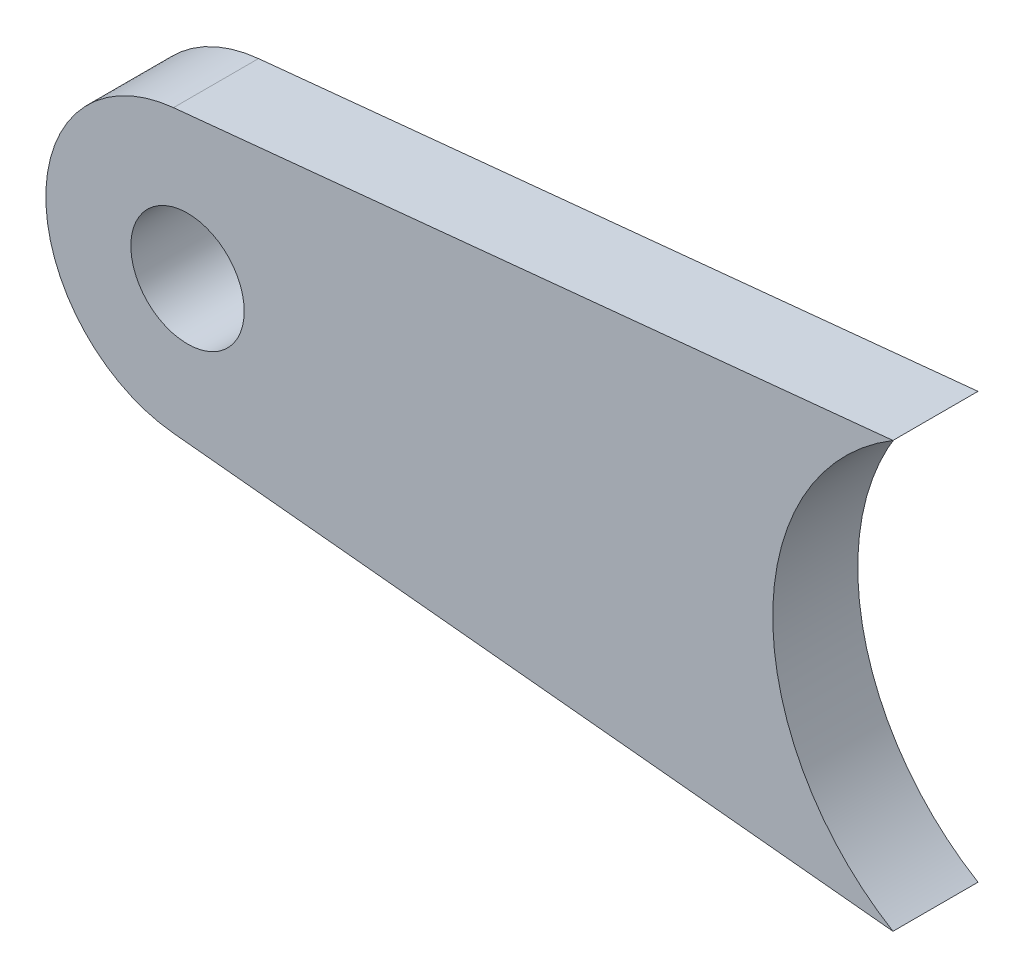
ISO-10303-21;
HEADER;
FILE_DESCRIPTION(('STEP AP214'),'2;1');
FILE_NAME('part.step','',(''),(''),'','','');
FILE_SCHEMA(('AUTOMOTIVE_DESIGN { 1 0 10303 214 1 1 1 1 }'));
ENDSEC;
DATA;
#1=APPLICATION_CONTEXT('core data for automotive mechanical design processes');
#2=APPLICATION_PROTOCOL_DEFINITION('international standard','automotive_design',2000,#1);
#3=PRODUCT_CONTEXT('',#1,'mechanical');
#4=PRODUCT('Part','Part','',(#3));
#5=PRODUCT_RELATED_PRODUCT_CATEGORY('part','',(#4));
#6=PRODUCT_DEFINITION_FORMATION('','',#4);
#7=PRODUCT_DEFINITION_CONTEXT('part definition',#1,'design');
#8=PRODUCT_DEFINITION('design','',#6,#7);
#9=PRODUCT_DEFINITION_SHAPE('','',#8);
#10=(LENGTH_UNIT() NAMED_UNIT(*) SI_UNIT(.MILLI.,.METRE.));
#11=(NAMED_UNIT(*) PLANE_ANGLE_UNIT() SI_UNIT($,.RADIAN.));
#12=(NAMED_UNIT(*) SI_UNIT($,.STERADIAN.) SOLID_ANGLE_UNIT());
#13=UNCERTAINTY_MEASURE_WITH_UNIT(LENGTH_MEASURE(1.E-05),#10,'distance_accuracy_value','');
#14=(GEOMETRIC_REPRESENTATION_CONTEXT(3) GLOBAL_UNCERTAINTY_ASSIGNED_CONTEXT((#13)) GLOBAL_UNIT_ASSIGNED_CONTEXT((#10,
#11,#12)) REPRESENTATION_CONTEXT('',''));
#15=CARTESIAN_POINT('',(0.,0.,0.));
#16=DIRECTION('',(0.,0.,1.));
#17=DIRECTION('',(1.,0.,0.));
#18=AXIS2_PLACEMENT_3D('',#15,#16,#17);
#19=CARTESIAN_POINT('',(111.141859777511,77.1269186430559,6.));
#20=DIRECTION('',(0.,0.,1.));
#21=DIRECTION('',(1.,0.,0.));
#22=AXIS2_PLACEMENT_3D('',#19,#20,#21);
#23=PLANE('',#22);
#24=CARTESIAN_POINT('',(111.141859777511,77.1269186430559,6.));
#25=DIRECTION('',(0.,0.,-1.));
#26=DIRECTION('',(1.,0.,0.));
#27=AXIS2_PLACEMENT_3D('',#24,#25,#26);
#28=CIRCLE('',#27,35.);
#29=CARTESIAN_POINT('',(93.114103400191,47.1269186430559,6.));
#30=VERTEX_POINT('',#29);
#31=CARTESIAN_POINT('',(93.114103400191,107.126918643056,6.));
#32=VERTEX_POINT('',#31);
#33=EDGE_CURVE('E87',#30,#32,#28,.T.);
#34=ORIENTED_EDGE('',*,*,#33,.T.);
#35=DIRECTION('',(-0.995092310823552,-0.0989509622987178,0.));
#36=VECTOR('',#35,1.);
#37=CARTESIAN_POINT('',(93.114103400191,107.126918643056,6.));
#38=LINE('',#37,#36);
#39=CARTESIAN_POINT('',(-8.43715946846341,97.028764859527,6.));
#40=VERTEX_POINT('',#39);
#41=EDGE_CURVE('E82',#32,#40,#38,.T.);
#42=ORIENTED_EDGE('',*,*,#41,.T.);
#43=CARTESIAN_POINT('',(-6.45814022248904,77.1269186430559,6.));
#44=DIRECTION('',(0.,0.,1.));
#45=DIRECTION('',(1.,0.,0.));
#46=AXIS2_PLACEMENT_3D('',#43,#44,#45);
#47=CIRCLE('',#46,20.);
#48=CARTESIAN_POINT('',(-8.43715946846342,57.2250724265849,6.));
#49=VERTEX_POINT('',#48);
#50=EDGE_CURVE('E85',#40,#49,#47,.T.);
#51=ORIENTED_EDGE('',*,*,#50,.T.);
#52=DIRECTION('',(0.995092310823552,-0.0989509622987179,0.));
#53=VECTOR('',#52,1.);
#54=CARTESIAN_POINT('',(-8.43715946846341,57.2250724265849,6.));
#55=LINE('',#54,#53);
#56=EDGE_CURVE('E52',#49,#30,#55,.T.);
#57=ORIENTED_EDGE('',*,*,#56,.T.);
#58=EDGE_LOOP('',(#34,#42,#51,#57));
#59=FACE_BOUND('',#58,.T.);
#60=CARTESIAN_POINT('',(-6.45814022248904,77.1269186430559,6.));
#61=DIRECTION('',(0.,0.,1.));
#62=DIRECTION('',(1.,0.,0.));
#63=AXIS2_PLACEMENT_3D('',#60,#61,#62);
#64=CIRCLE('',#63,8.);
#65=CARTESIAN_POINT('',(1.54185977751096,77.1269186430559,6.));
#66=VERTEX_POINT('',#65);
#67=EDGE_CURVE('E102',#66,#66,#64,.T.);
#68=ORIENTED_EDGE('',*,*,#67,.F.);
#69=EDGE_LOOP('',(#68));
#70=FACE_BOUND('',#69,.T.);
#71=ADVANCED_FACE('F35',(#59,#70),#23,.T.);
#72=CARTESIAN_POINT('',(111.141859777511,77.1269186430559,-6.));
#73=DIRECTION('',(0.,0.,1.));
#74=DIRECTION('',(1.,0.,0.));
#75=AXIS2_PLACEMENT_3D('',#72,#73,#74);
#76=PLANE('',#75);
#77=CARTESIAN_POINT('',(111.141859777511,77.1269186430559,-6.));
#78=DIRECTION('',(0.,0.,-1.));
#79=DIRECTION('',(1.,0.,0.));
#80=AXIS2_PLACEMENT_3D('',#77,#78,#79);
#81=CIRCLE('',#80,35.);
#82=CARTESIAN_POINT('',(93.114103400191,47.1269186430559,-6.));
#83=VERTEX_POINT('',#82);
#84=CARTESIAN_POINT('',(93.114103400191,107.126918643056,-6.));
#85=VERTEX_POINT('',#84);
#86=EDGE_CURVE('E99',#83,#85,#81,.T.);
#87=ORIENTED_EDGE('',*,*,#86,.F.);
#88=DIRECTION('',(0.995092310823552,-0.0989509622987179,0.));
#89=VECTOR('',#88,1.);
#90=CARTESIAN_POINT('',(-8.43715946846341,57.2250724265849,-6.));
#91=LINE('',#90,#89);
#92=CARTESIAN_POINT('',(-8.43715946846342,57.2250724265849,-6.));
#93=VERTEX_POINT('',#92);
#94=EDGE_CURVE('E75',#93,#83,#91,.T.);
#95=ORIENTED_EDGE('',*,*,#94,.F.);
#96=CARTESIAN_POINT('',(-6.45814022248904,77.1269186430559,-6.));
#97=DIRECTION('',(0.,0.,1.));
#98=DIRECTION('',(1.,0.,0.));
#99=AXIS2_PLACEMENT_3D('',#96,#97,#98);
#100=CIRCLE('',#99,20.);
#101=CARTESIAN_POINT('',(-8.43715946846341,97.028764859527,-6.));
#102=VERTEX_POINT('',#101);
#103=EDGE_CURVE('E69',#102,#93,#100,.T.);
#104=ORIENTED_EDGE('',*,*,#103,.F.);
#105=DIRECTION('',(-0.995092310823552,-0.0989509622987178,0.));
#106=VECTOR('',#105,1.);
#107=CARTESIAN_POINT('',(93.114103400191,107.126918643056,-6.));
#108=LINE('',#107,#106);
#109=EDGE_CURVE('E91',#85,#102,#108,.T.);
#110=ORIENTED_EDGE('',*,*,#109,.F.);
#111=EDGE_LOOP('',(#87,#95,#104,#110));
#112=FACE_BOUND('',#111,.T.);
#113=CARTESIAN_POINT('',(-6.45814022248904,77.1269186430559,-6.));
#114=DIRECTION('',(0.,0.,1.));
#115=DIRECTION('',(1.,0.,0.));
#116=AXIS2_PLACEMENT_3D('',#113,#114,#115);
#117=CIRCLE('',#116,8.);
#118=CARTESIAN_POINT('',(1.54185977751096,77.1269186430559,-6.));
#119=VERTEX_POINT('',#118);
#120=EDGE_CURVE('E114',#119,#119,#117,.T.);
#121=ORIENTED_EDGE('',*,*,#120,.T.);
#122=EDGE_LOOP('',(#121));
#123=FACE_BOUND('',#122,.T.);
#124=ADVANCED_FACE('F110',(#112,#123),#76,.F.);
#125=CARTESIAN_POINT('',(111.141859777511,77.1269186430559,6.));
#126=DIRECTION('',(0.,0.,-1.));
#127=DIRECTION('',(-1.,0.,0.));
#128=AXIS2_PLACEMENT_3D('',#125,#126,#127);
#129=CYLINDRICAL_SURFACE('',#128,35.);
#130=ORIENTED_EDGE('',*,*,#86,.T.);
#131=DIRECTION('',(0.,0.,-1.));
#132=VECTOR('',#131,1.);
#133=CARTESIAN_POINT('',(93.114103400191,107.126918643056,6.));
#134=LINE('',#133,#132);
#135=EDGE_CURVE('E11',#32,#85,#134,.T.);
#136=ORIENTED_EDGE('',*,*,#135,.F.);
#137=ORIENTED_EDGE('',*,*,#33,.F.);
#138=DIRECTION('',(0.,0.,-1.));
#139=VECTOR('',#138,1.);
#140=CARTESIAN_POINT('',(93.114103400191,47.1269186430559,6.));
#141=LINE('',#140,#139);
#142=EDGE_CURVE('E95',#30,#83,#141,.T.);
#143=ORIENTED_EDGE('',*,*,#142,.T.);
#144=EDGE_LOOP('',(#130,#136,#137,#143));
#145=FACE_BOUND('',#144,.T.);
#146=ADVANCED_FACE('F37',(#145),#129,.F.);
#147=CARTESIAN_POINT('',(93.114103400191,107.126918643056,6.));
#148=DIRECTION('',(0.0989509622987179,-0.995092310823553,0.));
#149=DIRECTION('',(0.995092310823553,0.0989509622987179,0.));
#150=AXIS2_PLACEMENT_3D('',#147,#148,#149);
#151=PLANE('',#150);
#152=ORIENTED_EDGE('',*,*,#109,.T.);
#153=DIRECTION('',(0.,0.,-1.));
#154=VECTOR('',#153,1.);
#155=CARTESIAN_POINT('',(-8.43715946846341,97.028764859527,6.));
#156=LINE('',#155,#154);
#157=EDGE_CURVE('E44',#40,#102,#156,.T.);
#158=ORIENTED_EDGE('',*,*,#157,.F.);
#159=ORIENTED_EDGE('',*,*,#41,.F.);
#160=ORIENTED_EDGE('',*,*,#135,.T.);
#161=EDGE_LOOP('',(#152,#158,#159,#160));
#162=FACE_BOUND('',#161,.T.);
#163=ADVANCED_FACE('F90',(#162),#151,.F.);
#164=CARTESIAN_POINT('',(-6.45814022248904,77.1269186430559,6.));
#165=DIRECTION('',(0.,0.,-1.));
#166=DIRECTION('',(-1.,0.,0.));
#167=AXIS2_PLACEMENT_3D('',#164,#165,#166);
#168=CYLINDRICAL_SURFACE('',#167,20.);
#169=ORIENTED_EDGE('',*,*,#103,.T.);
#170=DIRECTION('',(0.,0.,-1.));
#171=VECTOR('',#170,1.);
#172=CARTESIAN_POINT('',(-8.43715946846342,57.2250724265849,6.));
#173=LINE('',#172,#171);
#174=EDGE_CURVE('E92',#49,#93,#173,.T.);
#175=ORIENTED_EDGE('',*,*,#174,.F.);
#176=ORIENTED_EDGE('',*,*,#50,.F.);
#177=ORIENTED_EDGE('',*,*,#157,.T.);
#178=EDGE_LOOP('',(#169,#175,#176,#177));
#179=FACE_BOUND('',#178,.T.);
#180=ADVANCED_FACE('F93',(#179),#168,.T.);
#181=CARTESIAN_POINT('',(-8.43715946846341,57.2250724265849,6.));
#182=DIRECTION('',(0.0989509622987179,0.995092310823553,0.));
#183=DIRECTION('',(-0.995092310823553,0.0989509622987179,0.));
#184=AXIS2_PLACEMENT_3D('',#181,#182,#183);
#185=PLANE('',#184);
#186=ORIENTED_EDGE('',*,*,#94,.T.);
#187=ORIENTED_EDGE('',*,*,#142,.F.);
#188=ORIENTED_EDGE('',*,*,#56,.F.);
#189=ORIENTED_EDGE('',*,*,#174,.T.);
#190=EDGE_LOOP('',(#186,#187,#188,#189));
#191=FACE_BOUND('',#190,.T.);
#192=ADVANCED_FACE('F107',(#191),#185,.F.);
#193=CARTESIAN_POINT('',(-6.45814022248904,77.1269186430559,6.));
#194=DIRECTION('',(0.,0.,-1.));
#195=DIRECTION('',(-1.,0.,0.));
#196=AXIS2_PLACEMENT_3D('',#193,#194,#195);
#197=CYLINDRICAL_SURFACE('',#196,8.);
#198=ORIENTED_EDGE('',*,*,#67,.T.);
#199=EDGE_LOOP('',(#198));
#200=FACE_BOUND('',#199,.T.);
#201=ORIENTED_EDGE('',*,*,#120,.F.);
#202=EDGE_LOOP('',(#201));
#203=FACE_BOUND('',#202,.T.);
#204=ADVANCED_FACE('F120',(#200,#203),#197,.F.);
#205=CLOSED_SHELL('',(#71,#124,#146,#163,#180,#192,#204));
#206=MANIFOLD_SOLID_BREP('B2',#205);
#207=ADVANCED_BREP_SHAPE_REPRESENTATION('',(#18,#206),#14);
#208=SHAPE_DEFINITION_REPRESENTATION(#9,#207);
ENDSEC;
END-ISO-10303-21;
